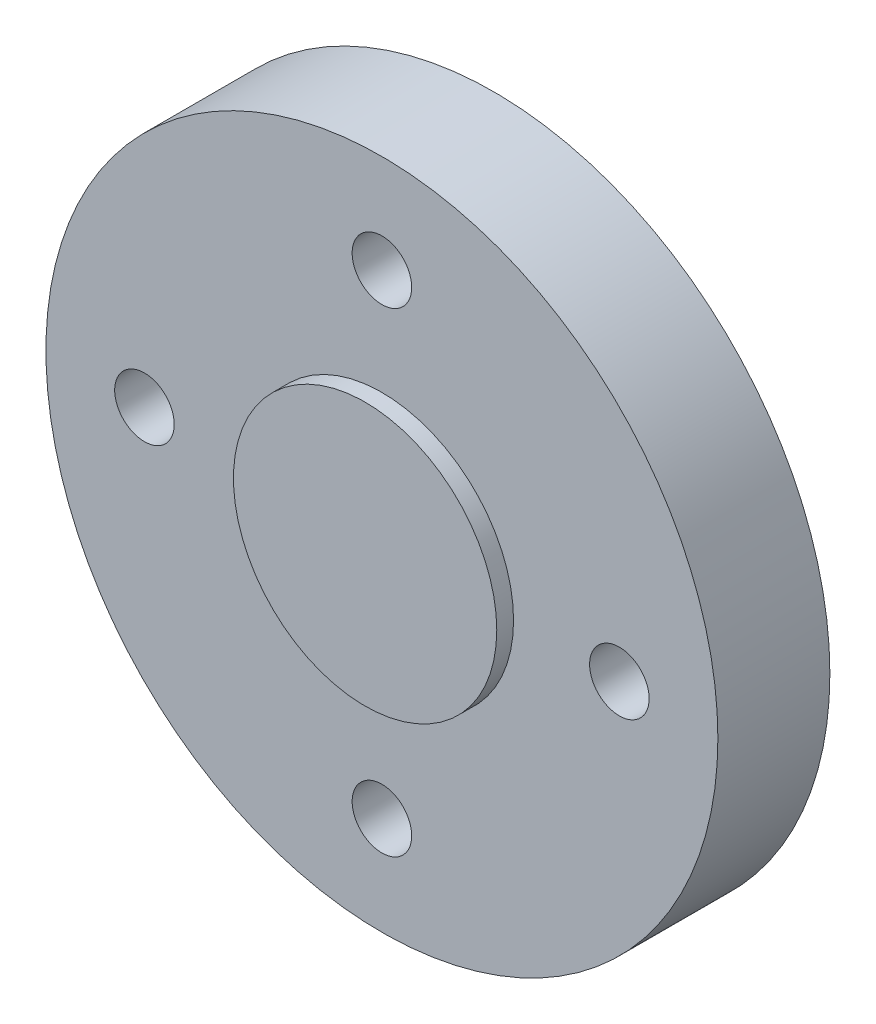
ISO-10303-21;
HEADER;
FILE_DESCRIPTION(('STEP AP214'),'2;1');
FILE_NAME('part.step','',(''),(''),'','','');
FILE_SCHEMA(('AUTOMOTIVE_DESIGN { 1 0 10303 214 1 1 1 1 }'));
ENDSEC;
DATA;
#1=APPLICATION_CONTEXT('core data for automotive mechanical design processes');
#2=APPLICATION_PROTOCOL_DEFINITION('international standard','automotive_design',2000,#1);
#3=PRODUCT_CONTEXT('',#1,'mechanical');
#4=PRODUCT('Part','Part','',(#3));
#5=PRODUCT_RELATED_PRODUCT_CATEGORY('part','',(#4));
#6=PRODUCT_DEFINITION_FORMATION('','',#4);
#7=PRODUCT_DEFINITION_CONTEXT('part definition',#1,'design');
#8=PRODUCT_DEFINITION('design','',#6,#7);
#9=PRODUCT_DEFINITION_SHAPE('','',#8);
#10=(LENGTH_UNIT() NAMED_UNIT(*) SI_UNIT(.MILLI.,.METRE.));
#11=(NAMED_UNIT(*) PLANE_ANGLE_UNIT() SI_UNIT($,.RADIAN.));
#12=(NAMED_UNIT(*) SI_UNIT($,.STERADIAN.) SOLID_ANGLE_UNIT());
#13=UNCERTAINTY_MEASURE_WITH_UNIT(LENGTH_MEASURE(1.E-05),#10,'distance_accuracy_value','');
#14=(GEOMETRIC_REPRESENTATION_CONTEXT(3) GLOBAL_UNCERTAINTY_ASSIGNED_CONTEXT((#13)) GLOBAL_UNIT_ASSIGNED_CONTEXT((#10,
#11,#12)) REPRESENTATION_CONTEXT('',''));
#15=CARTESIAN_POINT('',(0.,0.,0.));
#16=DIRECTION('',(0.,0.,1.));
#17=DIRECTION('',(1.,0.,0.));
#18=AXIS2_PLACEMENT_3D('',#15,#16,#17);
#19=CARTESIAN_POINT('',(0.,0.,10.));
#20=DIRECTION('',(0.,0.,-1.));
#21=DIRECTION('',(-1.,0.,0.));
#22=AXIS2_PLACEMENT_3D('',#19,#20,#21);
#23=CYLINDRICAL_SURFACE('',#22,30.);
#24=CARTESIAN_POINT('',(0.,0.,10.));
#25=DIRECTION('',(0.,0.,1.));
#26=DIRECTION('',(1.,0.,0.));
#27=AXIS2_PLACEMENT_3D('',#24,#25,#26);
#28=CIRCLE('',#27,30.);
#29=CARTESIAN_POINT('',(30.,0.,10.));
#30=VERTEX_POINT('',#29);
#31=EDGE_CURVE('E10',#30,#30,#28,.T.);
#32=ORIENTED_EDGE('',*,*,#31,.F.);
#33=EDGE_LOOP('',(#32));
#34=FACE_BOUND('',#33,.T.);
#35=CARTESIAN_POINT('',(0.,0.,0.));
#36=DIRECTION('',(0.,0.,1.));
#37=DIRECTION('',(1.,0.,0.));
#38=AXIS2_PLACEMENT_3D('',#35,#36,#37);
#39=CIRCLE('',#38,30.);
#40=CARTESIAN_POINT('',(30.,0.,0.));
#41=VERTEX_POINT('',#40);
#42=EDGE_CURVE('E45',#41,#41,#39,.T.);
#43=ORIENTED_EDGE('',*,*,#42,.T.);
#44=EDGE_LOOP('',(#43));
#45=FACE_BOUND('',#44,.T.);
#46=ADVANCED_FACE('F37',(#34,#45),#23,.T.);
#47=CARTESIAN_POINT('',(0.,0.,10.));
#48=DIRECTION('',(0.,0.,1.));
#49=DIRECTION('',(1.,0.,0.));
#50=AXIS2_PLACEMENT_3D('',#47,#48,#49);
#51=PLANE('',#50);
#52=CARTESIAN_POINT('',(0.,-21.2033623200423,10.));
#53=DIRECTION('',(0.,0.,1.));
#54=DIRECTION('',(1.,0.,0.));
#55=AXIS2_PLACEMENT_3D('',#52,#53,#54);
#56=CIRCLE('',#55,2.65825020452312);
#57=CARTESIAN_POINT('',(2.65825020452312,-21.2033623200423,10.));
#58=VERTEX_POINT('',#57);
#59=EDGE_CURVE('E65',#58,#58,#56,.T.);
#60=ORIENTED_EDGE('',*,*,#59,.F.);
#61=EDGE_LOOP('',(#60));
#62=FACE_BOUND('',#61,.T.);
#63=CARTESIAN_POINT('',(-21.2033623200423,0.,10.));
#64=DIRECTION('',(0.,0.,1.));
#65=DIRECTION('',(1.,0.,0.));
#66=AXIS2_PLACEMENT_3D('',#63,#64,#65);
#67=CIRCLE('',#66,2.65825020452312);
#68=CARTESIAN_POINT('',(-18.5451121155191,0.,10.));
#69=VERTEX_POINT('',#68);
#70=EDGE_CURVE('E115',#69,#69,#67,.T.);
#71=ORIENTED_EDGE('',*,*,#70,.F.);
#72=EDGE_LOOP('',(#71));
#73=FACE_BOUND('',#72,.T.);
#74=CARTESIAN_POINT('',(1.48062287722314E-13,21.2033623200423,10.));
#75=DIRECTION('',(0.,0.,1.));
#76=DIRECTION('',(1.,0.,0.));
#77=AXIS2_PLACEMENT_3D('',#74,#75,#76);
#78=CIRCLE('',#77,2.65825020452312);
#79=CARTESIAN_POINT('',(2.65825020452327,21.2033623200423,10.));
#80=VERTEX_POINT('',#79);
#81=EDGE_CURVE('E119',#80,#80,#78,.T.);
#82=ORIENTED_EDGE('',*,*,#81,.F.);
#83=EDGE_LOOP('',(#82));
#84=FACE_BOUND('',#83,.T.);
#85=CARTESIAN_POINT('',(21.2033623200423,-2.22093431583472E-13,10.));
#86=DIRECTION('',(0.,0.,1.));
#87=DIRECTION('',(1.,0.,0.));
#88=AXIS2_PLACEMENT_3D('',#85,#86,#87);
#89=CIRCLE('',#88,2.65825020452312);
#90=CARTESIAN_POINT('',(23.8616125245654,-2.22093431583472E-13,10.));
#91=VERTEX_POINT('',#90);
#92=EDGE_CURVE('E123',#91,#91,#89,.T.);
#93=ORIENTED_EDGE('',*,*,#92,.F.);
#94=EDGE_LOOP('',(#93));
#95=FACE_BOUND('',#94,.T.);
#96=CARTESIAN_POINT('',(0.,0.,10.));
#97=DIRECTION('',(0.,0.,1.));
#98=DIRECTION('',(1.,0.,0.));
#99=AXIS2_PLACEMENT_3D('',#96,#97,#98);
#100=CIRCLE('',#99,11.7559719557031);
#101=CARTESIAN_POINT('',(11.7559719557031,0.,10.));
#102=VERTEX_POINT('',#101);
#103=EDGE_CURVE('E51',#102,#102,#100,.F.);
#104=ORIENTED_EDGE('',*,*,#103,.T.);
#105=EDGE_LOOP('',(#104));
#106=FACE_BOUND('',#105,.T.);
#107=ORIENTED_EDGE('',*,*,#31,.T.);
#108=EDGE_LOOP('',(#107));
#109=FACE_BOUND('',#108,.T.);
#110=ADVANCED_FACE('F94',(#62,#73,#84,#95,#106,#109),#51,.T.);
#111=CARTESIAN_POINT('',(0.,0.,0.));
#112=DIRECTION('',(0.,0.,1.));
#113=DIRECTION('',(1.,0.,0.));
#114=AXIS2_PLACEMENT_3D('',#111,#112,#113);
#115=PLANE('',#114);
#116=CARTESIAN_POINT('',(0.,0.,0.));
#117=DIRECTION('',(0.,0.,-1.));
#118=DIRECTION('',(-1.,0.,0.));
#119=AXIS2_PLACEMENT_3D('',#116,#117,#118);
#120=CIRCLE('',#119,10.6341500481015);
#121=CARTESIAN_POINT('',(-10.6341500481015,0.,0.));
#122=VERTEX_POINT('',#121);
#123=EDGE_CURVE('E131',#122,#122,#120,.T.);
#124=ORIENTED_EDGE('',*,*,#123,.F.);
#125=EDGE_LOOP('',(#124));
#126=FACE_BOUND('',#125,.T.);
#127=CARTESIAN_POINT('',(0.,-21.2033623200423,0.));
#128=DIRECTION('',(0.,0.,1.));
#129=DIRECTION('',(1.,0.,0.));
#130=AXIS2_PLACEMENT_3D('',#127,#128,#129);
#131=CIRCLE('',#130,2.65825020452312);
#132=CARTESIAN_POINT('',(2.65825020452312,-21.2033623200423,0.));
#133=VERTEX_POINT('',#132);
#134=EDGE_CURVE('E40',#133,#133,#131,.T.);
#135=ORIENTED_EDGE('',*,*,#134,.T.);
#136=EDGE_LOOP('',(#135));
#137=FACE_BOUND('',#136,.T.);
#138=CARTESIAN_POINT('',(-21.2033623200423,0.,0.));
#139=DIRECTION('',(0.,0.,1.));
#140=DIRECTION('',(1.,0.,0.));
#141=AXIS2_PLACEMENT_3D('',#138,#139,#140);
#142=CIRCLE('',#141,2.65825020452312);
#143=CARTESIAN_POINT('',(-18.5451121155191,0.,0.));
#144=VERTEX_POINT('',#143);
#145=EDGE_CURVE('E68',#144,#144,#142,.T.);
#146=ORIENTED_EDGE('',*,*,#145,.T.);
#147=EDGE_LOOP('',(#146));
#148=FACE_BOUND('',#147,.T.);
#149=CARTESIAN_POINT('',(1.48062287722314E-13,21.2033623200423,0.));
#150=DIRECTION('',(0.,0.,1.));
#151=DIRECTION('',(1.,0.,0.));
#152=AXIS2_PLACEMENT_3D('',#149,#150,#151);
#153=CIRCLE('',#152,2.65825020452312);
#154=CARTESIAN_POINT('',(2.65825020452327,21.2033623200423,0.));
#155=VERTEX_POINT('',#154);
#156=EDGE_CURVE('E64',#155,#155,#153,.T.);
#157=ORIENTED_EDGE('',*,*,#156,.T.);
#158=EDGE_LOOP('',(#157));
#159=FACE_BOUND('',#158,.T.);
#160=CARTESIAN_POINT('',(21.2033623200423,-2.22093431583472E-13,0.));
#161=DIRECTION('',(0.,0.,1.));
#162=DIRECTION('',(1.,0.,0.));
#163=AXIS2_PLACEMENT_3D('',#160,#161,#162);
#164=CIRCLE('',#163,2.65825020452312);
#165=CARTESIAN_POINT('',(23.8616125245654,-2.22093431583472E-13,0.));
#166=VERTEX_POINT('',#165);
#167=EDGE_CURVE('E60',#166,#166,#164,.T.);
#168=ORIENTED_EDGE('',*,*,#167,.T.);
#169=EDGE_LOOP('',(#168));
#170=FACE_BOUND('',#169,.T.);
#171=ORIENTED_EDGE('',*,*,#42,.F.);
#172=EDGE_LOOP('',(#171));
#173=FACE_BOUND('',#172,.T.);
#174=ADVANCED_FACE('F85',(#126,#137,#148,#159,#170,#173),#115,.F.);
#175=CARTESIAN_POINT('',(0.,0.,11.5));
#176=DIRECTION('',(0.,0.,-1.));
#177=DIRECTION('',(-1.,0.,0.));
#178=AXIS2_PLACEMENT_3D('',#175,#176,#177);
#179=CYLINDRICAL_SURFACE('',#178,11.7559719557031);
#180=ORIENTED_EDGE('',*,*,#103,.F.);
#181=EDGE_LOOP('',(#180));
#182=FACE_BOUND('',#181,.T.);
#183=CARTESIAN_POINT('',(0.,0.,11.5));
#184=DIRECTION('',(0.,0.,1.));
#185=DIRECTION('',(1.,0.,0.));
#186=AXIS2_PLACEMENT_3D('',#183,#184,#185);
#187=CIRCLE('',#186,11.7559719557031);
#188=CARTESIAN_POINT('',(11.7559719557031,0.,11.5));
#189=VERTEX_POINT('',#188);
#190=EDGE_CURVE('E54',#189,#189,#187,.T.);
#191=ORIENTED_EDGE('',*,*,#190,.F.);
#192=EDGE_LOOP('',(#191));
#193=FACE_BOUND('',#192,.T.);
#194=ADVANCED_FACE('F83',(#182,#193),#179,.T.);
#195=CARTESIAN_POINT('',(0.,0.,11.5));
#196=DIRECTION('',(0.,0.,1.));
#197=DIRECTION('',(1.,0.,0.));
#198=AXIS2_PLACEMENT_3D('',#195,#196,#197);
#199=PLANE('',#198);
#200=ORIENTED_EDGE('',*,*,#190,.T.);
#201=EDGE_LOOP('',(#200));
#202=FACE_BOUND('',#201,.T.);
#203=ADVANCED_FACE('F81',(#202),#199,.T.);
#204=CARTESIAN_POINT('',(21.2033623200423,-2.22093431583472E-13,-16.));
#205=DIRECTION('',(0.,0.,1.));
#206=DIRECTION('',(1.,0.,0.));
#207=AXIS2_PLACEMENT_3D('',#204,#205,#206);
#208=CYLINDRICAL_SURFACE('',#207,2.65825020452312);
#209=ORIENTED_EDGE('',*,*,#92,.T.);
#210=EDGE_LOOP('',(#209));
#211=FACE_BOUND('',#210,.T.);
#212=ORIENTED_EDGE('',*,*,#167,.F.);
#213=EDGE_LOOP('',(#212));
#214=FACE_BOUND('',#213,.T.);
#215=ADVANCED_FACE('F92',(#211,#214),#208,.F.);
#216=CARTESIAN_POINT('',(1.48062287722314E-13,21.2033623200423,-16.));
#217=DIRECTION('',(0.,0.,1.));
#218=DIRECTION('',(1.,0.,0.));
#219=AXIS2_PLACEMENT_3D('',#216,#217,#218);
#220=CYLINDRICAL_SURFACE('',#219,2.65825020452312);
#221=ORIENTED_EDGE('',*,*,#81,.T.);
#222=EDGE_LOOP('',(#221));
#223=FACE_BOUND('',#222,.T.);
#224=ORIENTED_EDGE('',*,*,#156,.F.);
#225=EDGE_LOOP('',(#224));
#226=FACE_BOUND('',#225,.T.);
#227=ADVANCED_FACE('F149',(#223,#226),#220,.F.);
#228=CARTESIAN_POINT('',(-21.2033623200423,0.,-16.));
#229=DIRECTION('',(0.,0.,1.));
#230=DIRECTION('',(1.,0.,0.));
#231=AXIS2_PLACEMENT_3D('',#228,#229,#230);
#232=CYLINDRICAL_SURFACE('',#231,2.65825020452312);
#233=ORIENTED_EDGE('',*,*,#70,.T.);
#234=EDGE_LOOP('',(#233));
#235=FACE_BOUND('',#234,.T.);
#236=ORIENTED_EDGE('',*,*,#145,.F.);
#237=EDGE_LOOP('',(#236));
#238=FACE_BOUND('',#237,.T.);
#239=ADVANCED_FACE('F154',(#235,#238),#232,.F.);
#240=CARTESIAN_POINT('',(0.,-21.2033623200423,-16.));
#241=DIRECTION('',(0.,0.,1.));
#242=DIRECTION('',(1.,0.,0.));
#243=AXIS2_PLACEMENT_3D('',#240,#241,#242);
#244=CYLINDRICAL_SURFACE('',#243,2.65825020452312);
#245=ORIENTED_EDGE('',*,*,#59,.T.);
#246=EDGE_LOOP('',(#245));
#247=FACE_BOUND('',#246,.T.);
#248=ORIENTED_EDGE('',*,*,#134,.F.);
#249=EDGE_LOOP('',(#248));
#250=FACE_BOUND('',#249,.T.);
#251=ADVANCED_FACE('F160',(#247,#250),#244,.F.);
#252=CARTESIAN_POINT('',(0.,0.,9.5));
#253=DIRECTION('',(0.,0.,-1.));
#254=DIRECTION('',(-1.,0.,0.));
#255=AXIS2_PLACEMENT_3D('',#252,#253,#254);
#256=CYLINDRICAL_SURFACE('',#255,10.6341500481015);
#257=CARTESIAN_POINT('',(0.,0.,9.5));
#258=DIRECTION('',(0.,0.,-1.));
#259=DIRECTION('',(-1.,0.,0.));
#260=AXIS2_PLACEMENT_3D('',#257,#258,#259);
#261=CIRCLE('',#260,10.6341500481015);
#262=CARTESIAN_POINT('',(-10.6341500481015,0.,9.5));
#263=VERTEX_POINT('',#262);
#264=EDGE_CURVE('E126',#263,#263,#261,.T.);
#265=ORIENTED_EDGE('',*,*,#264,.F.);
#266=EDGE_LOOP('',(#265));
#267=FACE_BOUND('',#266,.T.);
#268=ORIENTED_EDGE('',*,*,#123,.T.);
#269=EDGE_LOOP('',(#268));
#270=FACE_BOUND('',#269,.T.);
#271=ADVANCED_FACE('F142',(#267,#270),#256,.F.);
#272=CARTESIAN_POINT('',(0.,0.,9.5));
#273=DIRECTION('',(0.,0.,-1.));
#274=DIRECTION('',(-1.,0.,0.));
#275=AXIS2_PLACEMENT_3D('',#272,#273,#274);
#276=PLANE('',#275);
#277=ORIENTED_EDGE('',*,*,#264,.T.);
#278=EDGE_LOOP('',(#277));
#279=FACE_BOUND('',#278,.T.);
#280=ADVANCED_FACE('F167',(#279),#276,.T.);
#281=CLOSED_SHELL('',(#46,#110,#174,#194,#203,#215,#227,#239,#251,#271,#280));
#282=MANIFOLD_SOLID_BREP('B2',#281);
#283=ADVANCED_BREP_SHAPE_REPRESENTATION('',(#18,#282),#14);
#284=SHAPE_DEFINITION_REPRESENTATION(#9,#283);
ENDSEC;
END-ISO-10303-21;
